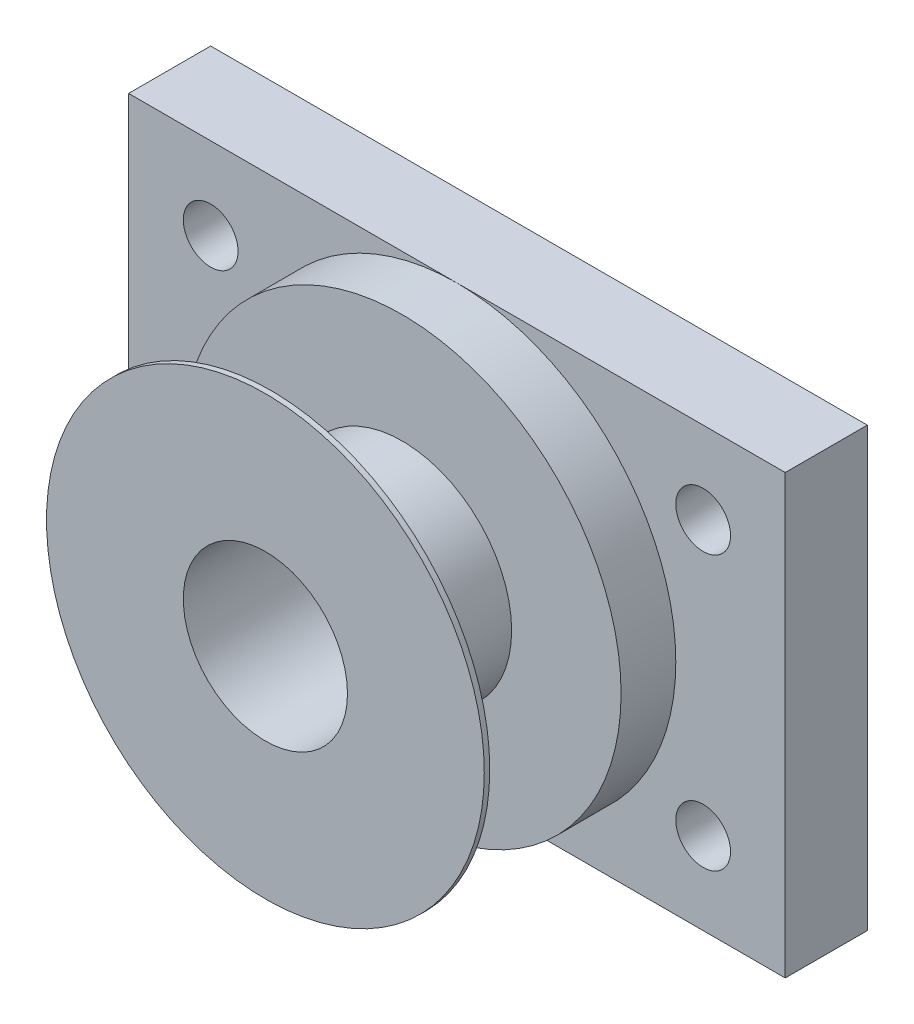
ISO-10303-21;
HEADER;
FILE_DESCRIPTION(('STEP AP214'),'2;1');
FILE_NAME('part.step','',(''),(''),'','','');
FILE_SCHEMA(('AUTOMOTIVE_DESIGN { 1 0 10303 214 1 1 1 1 }'));
ENDSEC;
DATA;
#1=APPLICATION_CONTEXT('core data for automotive mechanical design processes');
#2=APPLICATION_PROTOCOL_DEFINITION('international standard','automotive_design',2000,#1);
#3=PRODUCT_CONTEXT('',#1,'mechanical');
#4=PRODUCT('Part','Part','',(#3));
#5=PRODUCT_RELATED_PRODUCT_CATEGORY('part','',(#4));
#6=PRODUCT_DEFINITION_FORMATION('','',#4);
#7=PRODUCT_DEFINITION_CONTEXT('part definition',#1,'design');
#8=PRODUCT_DEFINITION('design','',#6,#7);
#9=PRODUCT_DEFINITION_SHAPE('','',#8);
#10=(LENGTH_UNIT() NAMED_UNIT(*) SI_UNIT(.MILLI.,.METRE.));
#11=(NAMED_UNIT(*) PLANE_ANGLE_UNIT() SI_UNIT($,.RADIAN.));
#12=(NAMED_UNIT(*) SI_UNIT($,.STERADIAN.) SOLID_ANGLE_UNIT());
#13=UNCERTAINTY_MEASURE_WITH_UNIT(LENGTH_MEASURE(1.E-05),#10,'distance_accuracy_value','');
#14=(GEOMETRIC_REPRESENTATION_CONTEXT(3) GLOBAL_UNCERTAINTY_ASSIGNED_CONTEXT((#13)) GLOBAL_UNIT_ASSIGNED_CONTEXT((#10,
#11,#12)) REPRESENTATION_CONTEXT('',''));
#15=CARTESIAN_POINT('',(0.,0.,0.));
#16=DIRECTION('',(0.,0.,1.));
#17=DIRECTION('',(1.,0.,0.));
#18=AXIS2_PLACEMENT_3D('',#15,#16,#17);
#19=CARTESIAN_POINT('',(0.,0.,15.));
#20=DIRECTION('',(0.,0.,1.));
#21=DIRECTION('',(1.,0.,0.));
#22=AXIS2_PLACEMENT_3D('',#19,#20,#21);
#23=PLANE('',#22);
#24=CARTESIAN_POINT('',(0.,0.,15.));
#25=DIRECTION('',(0.,0.,-1.));
#26=DIRECTION('',(1.,0.,0.));
#27=AXIS2_PLACEMENT_3D('',#24,#25,#26);
#28=CIRCLE('',#27,15.);
#29=CARTESIAN_POINT('',(15.,0.,15.));
#30=VERTEX_POINT('',#29);
#31=EDGE_CURVE('E24',#30,#30,#28,.T.);
#32=ORIENTED_EDGE('',*,*,#31,.F.);
#33=EDGE_LOOP('',(#32));
#34=FACE_BOUND('',#33,.T.);
#35=ADVANCED_FACE('F15',(#34),#23,.T.);
#36=CARTESIAN_POINT('',(0.,0.,0.));
#37=DIRECTION('',(0.,0.,-1.));
#38=DIRECTION('',(1.,0.,0.));
#39=AXIS2_PLACEMENT_3D('',#36,#37,#38);
#40=CYLINDRICAL_SURFACE('',#39,15.);
#41=ORIENTED_EDGE('',*,*,#31,.T.);
#42=DIRECTION('',(0.,0.,1.));
#43=VECTOR('',#42,1.);
#44=CARTESIAN_POINT('',(15.,0.,0.));
#45=LINE('',#44,#43);
#46=CARTESIAN_POINT('',(15.,0.,50.));
#47=VERTEX_POINT('',#46);
#48=EDGE_CURVE('E9',#30,#47,#45,.T.);
#49=ORIENTED_EDGE('',*,*,#48,.T.);
#50=CARTESIAN_POINT('',(0.,0.,50.));
#51=DIRECTION('',(0.,0.,-1.));
#52=DIRECTION('',(1.,0.,0.));
#53=AXIS2_PLACEMENT_3D('',#50,#51,#52);
#54=CIRCLE('',#53,15.);
#55=EDGE_CURVE('E91',#47,#47,#54,.T.);
#56=ORIENTED_EDGE('',*,*,#55,.F.);
#57=ORIENTED_EDGE('',*,*,#48,.F.);
#58=EDGE_LOOP('',(#41,#49,#56,#57));
#59=FACE_BOUND('',#58,.T.);
#60=ADVANCED_FACE('F156',(#59),#40,.F.);
#61=CARTESIAN_POINT('',(0.,0.,50.));
#62=DIRECTION('',(0.,0.,1.));
#63=DIRECTION('',(1.,0.,0.));
#64=AXIS2_PLACEMENT_3D('',#61,#62,#63);
#65=PLANE('',#64);
#66=ORIENTED_EDGE('',*,*,#55,.T.);
#67=EDGE_LOOP('',(#66));
#68=FACE_BOUND('',#67,.T.);
#69=CARTESIAN_POINT('',(0.,0.,50.));
#70=DIRECTION('',(0.,0.,1.));
#71=DIRECTION('',(1.,0.,0.));
#72=AXIS2_PLACEMENT_3D('',#69,#70,#71);
#73=CIRCLE('',#72,40.);
#74=CARTESIAN_POINT('',(40.,0.,50.));
#75=VERTEX_POINT('',#74);
#76=EDGE_CURVE('E88',#75,#75,#73,.T.);
#77=ORIENTED_EDGE('',*,*,#76,.T.);
#78=EDGE_LOOP('',(#77));
#79=FACE_BOUND('',#78,.T.);
#80=ADVANCED_FACE('F89',(#68,#79),#65,.T.);
#81=CARTESIAN_POINT('',(0.,0.,49.));
#82=DIRECTION('',(0.,0.,1.));
#83=DIRECTION('',(1.,0.,0.));
#84=AXIS2_PLACEMENT_3D('',#81,#82,#83);
#85=CYLINDRICAL_SURFACE('',#84,40.);
#86=CARTESIAN_POINT('',(0.,0.,49.));
#87=DIRECTION('',(0.,0.,1.));
#88=DIRECTION('',(1.,0.,0.));
#89=AXIS2_PLACEMENT_3D('',#86,#87,#88);
#90=CIRCLE('',#89,40.);
#91=CARTESIAN_POINT('',(40.,0.,49.));
#92=VERTEX_POINT('',#91);
#93=EDGE_CURVE('E100',#92,#92,#90,.T.);
#94=ORIENTED_EDGE('',*,*,#93,.T.);
#95=DIRECTION('',(0.,0.,1.));
#96=VECTOR('',#95,1.);
#97=CARTESIAN_POINT('',(40.,0.,49.));
#98=LINE('',#97,#96);
#99=EDGE_CURVE('E83',#92,#75,#98,.T.);
#100=ORIENTED_EDGE('',*,*,#99,.T.);
#101=ORIENTED_EDGE('',*,*,#76,.F.);
#102=ORIENTED_EDGE('',*,*,#99,.F.);
#103=EDGE_LOOP('',(#94,#100,#101,#102));
#104=FACE_BOUND('',#103,.T.);
#105=ADVANCED_FACE('F167',(#104),#85,.T.);
#106=CARTESIAN_POINT('',(0.,0.,49.));
#107=DIRECTION('',(0.,0.,1.));
#108=DIRECTION('',(1.,0.,0.));
#109=AXIS2_PLACEMENT_3D('',#106,#107,#108);
#110=PLANE('',#109);
#111=ORIENTED_EDGE('',*,*,#93,.F.);
#112=EDGE_LOOP('',(#111));
#113=FACE_BOUND('',#112,.T.);
#114=CARTESIAN_POINT('',(0.,0.,49.));
#115=DIRECTION('',(0.,0.,1.));
#116=DIRECTION('',(1.,0.,0.));
#117=AXIS2_PLACEMENT_3D('',#114,#115,#116);
#118=CIRCLE('',#117,20.);
#119=CARTESIAN_POINT('',(20.,0.,49.));
#120=VERTEX_POINT('',#119);
#121=EDGE_CURVE('E133',#120,#120,#118,.T.);
#122=ORIENTED_EDGE('',*,*,#121,.T.);
#123=EDGE_LOOP('',(#122));
#124=FACE_BOUND('',#123,.T.);
#125=ADVANCED_FACE('F212',(#113,#124),#110,.F.);
#126=CARTESIAN_POINT('',(0.,0.,25.));
#127=DIRECTION('',(0.,0.,1.));
#128=DIRECTION('',(1.,0.,0.));
#129=AXIS2_PLACEMENT_3D('',#126,#127,#128);
#130=CYLINDRICAL_SURFACE('',#129,20.);
#131=CARTESIAN_POINT('',(0.,0.,25.));
#132=DIRECTION('',(0.,0.,1.));
#133=DIRECTION('',(1.,0.,0.));
#134=AXIS2_PLACEMENT_3D('',#131,#132,#133);
#135=CIRCLE('',#134,20.);
#136=CARTESIAN_POINT('',(20.,0.,25.));
#137=VERTEX_POINT('',#136);
#138=EDGE_CURVE('E134',#137,#137,#135,.T.);
#139=ORIENTED_EDGE('',*,*,#138,.T.);
#140=DIRECTION('',(0.,0.,1.));
#141=VECTOR('',#140,1.);
#142=CARTESIAN_POINT('',(20.,0.,25.));
#143=LINE('',#142,#141);
#144=EDGE_CURVE('E129',#137,#120,#143,.T.);
#145=ORIENTED_EDGE('',*,*,#144,.T.);
#146=ORIENTED_EDGE('',*,*,#121,.F.);
#147=ORIENTED_EDGE('',*,*,#144,.F.);
#148=EDGE_LOOP('',(#139,#145,#146,#147));
#149=FACE_BOUND('',#148,.T.);
#150=ADVANCED_FACE('F205',(#149),#130,.T.);
#151=CARTESIAN_POINT('',(0.,0.,25.));
#152=DIRECTION('',(0.,0.,1.));
#153=DIRECTION('',(1.,0.,0.));
#154=AXIS2_PLACEMENT_3D('',#151,#152,#153);
#155=PLANE('',#154);
#156=ORIENTED_EDGE('',*,*,#138,.F.);
#157=EDGE_LOOP('',(#156));
#158=FACE_BOUND('',#157,.T.);
#159=CARTESIAN_POINT('',(0.,0.,25.));
#160=DIRECTION('',(0.,0.,1.));
#161=DIRECTION('',(1.,0.,0.));
#162=AXIS2_PLACEMENT_3D('',#159,#160,#161);
#163=CIRCLE('',#162,40.);
#164=CARTESIAN_POINT('',(40.,0.,25.));
#165=VERTEX_POINT('',#164);
#166=EDGE_CURVE('E149',#165,#165,#163,.T.);
#167=ORIENTED_EDGE('',*,*,#166,.T.);
#168=EDGE_LOOP('',(#167));
#169=FACE_BOUND('',#168,.T.);
#170=ADVANCED_FACE('F202',(#158,#169),#155,.T.);
#171=CARTESIAN_POINT('',(0.,0.,0.));
#172=DIRECTION('',(0.,0.,1.));
#173=DIRECTION('',(1.,0.,0.));
#174=AXIS2_PLACEMENT_3D('',#171,#172,#173);
#175=CYLINDRICAL_SURFACE('',#174,40.);
#176=CARTESIAN_POINT('',(0.,0.,15.));
#177=DIRECTION('',(0.,0.,1.));
#178=DIRECTION('',(1.,0.,0.));
#179=AXIS2_PLACEMENT_3D('',#176,#177,#178);
#180=CIRCLE('',#179,40.);
#181=CARTESIAN_POINT('',(0.,-40.,15.));
#182=VERTEX_POINT('',#181);
#183=CARTESIAN_POINT('',(40.,0.,15.));
#184=VERTEX_POINT('',#183);
#185=EDGE_CURVE('E128',#182,#184,#180,.T.);
#186=ORIENTED_EDGE('',*,*,#185,.T.);
#187=DIRECTION('',(0.,0.,1.));
#188=VECTOR('',#187,1.);
#189=CARTESIAN_POINT('',(40.,0.,0.));
#190=LINE('',#189,#188);
#191=EDGE_CURVE('E145',#184,#165,#190,.T.);
#192=ORIENTED_EDGE('',*,*,#191,.T.);
#193=ORIENTED_EDGE('',*,*,#166,.F.);
#194=ORIENTED_EDGE('',*,*,#191,.F.);
#195=CARTESIAN_POINT('',(0.,0.,15.));
#196=DIRECTION('',(0.,0.,1.));
#197=DIRECTION('',(1.,0.,0.));
#198=AXIS2_PLACEMENT_3D('',#195,#196,#197);
#199=CIRCLE('',#198,40.);
#200=CARTESIAN_POINT('',(0.,40.,15.));
#201=VERTEX_POINT('',#200);
#202=EDGE_CURVE('E138',#184,#201,#199,.T.);
#203=ORIENTED_EDGE('',*,*,#202,.T.);
#204=CARTESIAN_POINT('',(0.,0.,15.));
#205=DIRECTION('',(0.,0.,1.));
#206=DIRECTION('',(1.,0.,0.));
#207=AXIS2_PLACEMENT_3D('',#204,#205,#206);
#208=CIRCLE('',#207,40.);
#209=EDGE_CURVE('E142',#201,#182,#208,.T.);
#210=ORIENTED_EDGE('',*,*,#209,.T.);
#211=EDGE_LOOP('',(#186,#192,#193,#194,#203,#210));
#212=FACE_BOUND('',#211,.T.);
#213=ADVANCED_FACE('F191',(#212),#175,.T.);
#214=CARTESIAN_POINT('',(0.,0.,15.));
#215=DIRECTION('',(0.,0.,1.));
#216=DIRECTION('',(1.,0.,0.));
#217=AXIS2_PLACEMENT_3D('',#214,#215,#216);
#218=PLANE('',#217);
#219=CARTESIAN_POINT('',(-45.,25.,15.));
#220=DIRECTION('',(0.,0.,-1.));
#221=DIRECTION('',(1.,0.,0.));
#222=AXIS2_PLACEMENT_3D('',#219,#220,#221);
#223=CIRCLE('',#222,5.);
#224=CARTESIAN_POINT('',(-40.,25.,15.));
#225=VERTEX_POINT('',#224);
#226=EDGE_CURVE('E125',#225,#225,#223,.T.);
#227=ORIENTED_EDGE('',*,*,#226,.T.);
#228=EDGE_LOOP('',(#227));
#229=FACE_BOUND('',#228,.T.);
#230=CARTESIAN_POINT('',(-45.,-25.,15.));
#231=DIRECTION('',(0.,0.,-1.));
#232=DIRECTION('',(1.,0.,0.));
#233=AXIS2_PLACEMENT_3D('',#230,#231,#232);
#234=CIRCLE('',#233,5.);
#235=CARTESIAN_POINT('',(-40.,-25.,15.));
#236=VERTEX_POINT('',#235);
#237=EDGE_CURVE('E117',#236,#236,#234,.T.);
#238=ORIENTED_EDGE('',*,*,#237,.T.);
#239=EDGE_LOOP('',(#238));
#240=FACE_BOUND('',#239,.T.);
#241=DIRECTION('',(0.,-1.,0.));
#242=VECTOR('',#241,1.);
#243=CARTESIAN_POINT('',(-60.,40.,15.));
#244=LINE('',#243,#242);
#245=CARTESIAN_POINT('',(-60.,40.,15.));
#246=VERTEX_POINT('',#245);
#247=CARTESIAN_POINT('',(-60.,-40.,15.));
#248=VERTEX_POINT('',#247);
#249=EDGE_CURVE('E109',#246,#248,#244,.T.);
#250=ORIENTED_EDGE('',*,*,#249,.T.);
#251=DIRECTION('',(1.,0.,0.));
#252=VECTOR('',#251,1.);
#253=CARTESIAN_POINT('',(-60.,-40.,15.));
#254=LINE('',#253,#252);
#255=EDGE_CURVE('E283',#248,#182,#254,.T.);
#256=ORIENTED_EDGE('',*,*,#255,.T.);
#257=ORIENTED_EDGE('',*,*,#209,.F.);
#258=DIRECTION('',(-1.,0.,0.));
#259=VECTOR('',#258,1.);
#260=CARTESIAN_POINT('',(60.,40.,15.));
#261=LINE('',#260,#259);
#262=EDGE_CURVE('E246',#201,#246,#261,.T.);
#263=ORIENTED_EDGE('',*,*,#262,.T.);
#264=EDGE_LOOP('',(#250,#256,#257,#263));
#265=FACE_BOUND('',#264,.T.);
#266=ADVANCED_FACE('F188',(#229,#240,#265),#218,.T.);
#267=CARTESIAN_POINT('',(0.,0.,15.));
#268=DIRECTION('',(0.,0.,1.));
#269=DIRECTION('',(1.,0.,0.));
#270=AXIS2_PLACEMENT_3D('',#267,#268,#269);
#271=PLANE('',#270);
#272=CARTESIAN_POINT('',(45.,25.,15.));
#273=DIRECTION('',(0.,0.,-1.));
#274=DIRECTION('',(1.,0.,0.));
#275=AXIS2_PLACEMENT_3D('',#272,#273,#274);
#276=CIRCLE('',#275,5.);
#277=CARTESIAN_POINT('',(50.,25.,15.));
#278=VERTEX_POINT('',#277);
#279=EDGE_CURVE('E106',#278,#278,#276,.T.);
#280=ORIENTED_EDGE('',*,*,#279,.T.);
#281=EDGE_LOOP('',(#280));
#282=FACE_BOUND('',#281,.T.);
#283=CARTESIAN_POINT('',(45.,-25.,15.));
#284=DIRECTION('',(0.,0.,-1.));
#285=DIRECTION('',(1.,0.,0.));
#286=AXIS2_PLACEMENT_3D('',#283,#284,#285);
#287=CIRCLE('',#286,5.);
#288=CARTESIAN_POINT('',(50.,-25.,15.));
#289=VERTEX_POINT('',#288);
#290=EDGE_CURVE('E272',#289,#289,#287,.T.);
#291=ORIENTED_EDGE('',*,*,#290,.T.);
#292=EDGE_LOOP('',(#291));
#293=FACE_BOUND('',#292,.T.);
#294=ORIENTED_EDGE('',*,*,#185,.F.);
#295=DIRECTION('',(1.,0.,0.));
#296=VECTOR('',#295,1.);
#297=CARTESIAN_POINT('',(-60.,-40.,15.));
#298=LINE('',#297,#296);
#299=CARTESIAN_POINT('',(60.,-40.,15.));
#300=VERTEX_POINT('',#299);
#301=EDGE_CURVE('E288',#182,#300,#298,.T.);
#302=ORIENTED_EDGE('',*,*,#301,.T.);
#303=DIRECTION('',(0.,1.,0.));
#304=VECTOR('',#303,1.);
#305=CARTESIAN_POINT('',(60.,-40.,15.));
#306=LINE('',#305,#304);
#307=CARTESIAN_POINT('',(60.,40.,15.));
#308=VERTEX_POINT('',#307);
#309=EDGE_CURVE('E289',#300,#308,#306,.T.);
#310=ORIENTED_EDGE('',*,*,#309,.T.);
#311=DIRECTION('',(-1.,0.,0.));
#312=VECTOR('',#311,1.);
#313=CARTESIAN_POINT('',(60.,40.,15.));
#314=LINE('',#313,#312);
#315=EDGE_CURVE('E242',#308,#201,#314,.T.);
#316=ORIENTED_EDGE('',*,*,#315,.T.);
#317=ORIENTED_EDGE('',*,*,#202,.F.);
#318=EDGE_LOOP('',(#294,#302,#310,#316,#317));
#319=FACE_BOUND('',#318,.T.);
#320=ADVANCED_FACE('F182',(#282,#293,#319),#271,.T.);
#321=CARTESIAN_POINT('',(-45.,25.,0.));
#322=DIRECTION('',(0.,0.,-1.));
#323=DIRECTION('',(1.,0.,0.));
#324=AXIS2_PLACEMENT_3D('',#321,#322,#323);
#325=CYLINDRICAL_SURFACE('',#324,5.);
#326=CARTESIAN_POINT('',(-45.,25.,0.));
#327=DIRECTION('',(0.,0.,1.));
#328=DIRECTION('',(1.,0.,0.));
#329=AXIS2_PLACEMENT_3D('',#326,#327,#328);
#330=CIRCLE('',#329,5.);
#331=CARTESIAN_POINT('',(-40.,25.,0.));
#332=VERTEX_POINT('',#331);
#333=EDGE_CURVE('E252',#332,#332,#330,.T.);
#334=ORIENTED_EDGE('',*,*,#333,.F.);
#335=DIRECTION('',(0.,0.,1.));
#336=VECTOR('',#335,1.);
#337=CARTESIAN_POINT('',(-40.,25.,0.));
#338=LINE('',#337,#336);
#339=EDGE_CURVE('E121',#332,#225,#338,.T.);
#340=ORIENTED_EDGE('',*,*,#339,.T.);
#341=ORIENTED_EDGE('',*,*,#226,.F.);
#342=ORIENTED_EDGE('',*,*,#339,.F.);
#343=EDGE_LOOP('',(#334,#340,#341,#342));
#344=FACE_BOUND('',#343,.T.);
#345=ADVANCED_FACE('F178',(#344),#325,.F.);
#346=CARTESIAN_POINT('',(-45.,-25.,0.));
#347=DIRECTION('',(0.,0.,-1.));
#348=DIRECTION('',(1.,0.,0.));
#349=AXIS2_PLACEMENT_3D('',#346,#347,#348);
#350=CYLINDRICAL_SURFACE('',#349,5.);
#351=CARTESIAN_POINT('',(-45.,-25.,0.));
#352=DIRECTION('',(0.,0.,1.));
#353=DIRECTION('',(1.,0.,0.));
#354=AXIS2_PLACEMENT_3D('',#351,#352,#353);
#355=CIRCLE('',#354,5.);
#356=CARTESIAN_POINT('',(-40.,-25.,0.));
#357=VERTEX_POINT('',#356);
#358=EDGE_CURVE('E248',#357,#357,#355,.T.);
#359=ORIENTED_EDGE('',*,*,#358,.F.);
#360=DIRECTION('',(0.,0.,1.));
#361=VECTOR('',#360,1.);
#362=CARTESIAN_POINT('',(-40.,-25.,0.));
#363=LINE('',#362,#361);
#364=EDGE_CURVE('E113',#357,#236,#363,.T.);
#365=ORIENTED_EDGE('',*,*,#364,.T.);
#366=ORIENTED_EDGE('',*,*,#237,.F.);
#367=ORIENTED_EDGE('',*,*,#364,.F.);
#368=EDGE_LOOP('',(#359,#365,#366,#367));
#369=FACE_BOUND('',#368,.T.);
#370=ADVANCED_FACE('F181',(#369),#350,.F.);
#371=CARTESIAN_POINT('',(-60.,40.,0.));
#372=DIRECTION('',(1.,0.,0.));
#373=DIRECTION('',(0.,1.,0.));
#374=AXIS2_PLACEMENT_3D('',#371,#372,#373);
#375=PLANE('',#374);
#376=DIRECTION('',(0.,-1.,0.));
#377=VECTOR('',#376,1.);
#378=CARTESIAN_POINT('',(-60.,40.,0.));
#379=LINE('',#378,#377);
#380=CARTESIAN_POINT('',(-60.,40.,0.));
#381=VERTEX_POINT('',#380);
#382=CARTESIAN_POINT('',(-60.,-40.,0.));
#383=VERTEX_POINT('',#382);
#384=EDGE_CURVE('E261',#381,#383,#379,.T.);
#385=ORIENTED_EDGE('',*,*,#384,.T.);
#386=DIRECTION('',(0.,0.,1.));
#387=VECTOR('',#386,1.);
#388=CARTESIAN_POINT('',(-60.,-40.,0.));
#389=LINE('',#388,#387);
#390=EDGE_CURVE('E287',#383,#248,#389,.T.);
#391=ORIENTED_EDGE('',*,*,#390,.T.);
#392=ORIENTED_EDGE('',*,*,#249,.F.);
#393=DIRECTION('',(0.,0.,1.));
#394=VECTOR('',#393,1.);
#395=CARTESIAN_POINT('',(-60.,40.,0.));
#396=LINE('',#395,#394);
#397=EDGE_CURVE('E251',#381,#246,#396,.T.);
#398=ORIENTED_EDGE('',*,*,#397,.F.);
#399=EDGE_LOOP('',(#385,#391,#392,#398));
#400=FACE_BOUND('',#399,.T.);
#401=ADVANCED_FACE('F186',(#400),#375,.F.);
#402=CARTESIAN_POINT('',(45.,25.,0.));
#403=DIRECTION('',(0.,0.,-1.));
#404=DIRECTION('',(1.,0.,0.));
#405=AXIS2_PLACEMENT_3D('',#402,#403,#404);
#406=CYLINDRICAL_SURFACE('',#405,5.);
#407=CARTESIAN_POINT('',(45.,25.,0.));
#408=DIRECTION('',(0.,0.,1.));
#409=DIRECTION('',(1.,0.,0.));
#410=AXIS2_PLACEMENT_3D('',#407,#408,#409);
#411=CIRCLE('',#410,5.);
#412=CARTESIAN_POINT('',(50.,25.,0.));
#413=VERTEX_POINT('',#412);
#414=EDGE_CURVE('E241',#413,#413,#411,.T.);
#415=ORIENTED_EDGE('',*,*,#414,.F.);
#416=DIRECTION('',(0.,0.,1.));
#417=VECTOR('',#416,1.);
#418=CARTESIAN_POINT('',(50.,25.,0.));
#419=LINE('',#418,#417);
#420=EDGE_CURVE('E104',#413,#278,#419,.T.);
#421=ORIENTED_EDGE('',*,*,#420,.T.);
#422=ORIENTED_EDGE('',*,*,#279,.F.);
#423=ORIENTED_EDGE('',*,*,#420,.F.);
#424=EDGE_LOOP('',(#415,#421,#422,#423));
#425=FACE_BOUND('',#424,.T.);
#426=ADVANCED_FACE('F176',(#425),#406,.F.);
#427=CARTESIAN_POINT('',(45.,-25.,0.));
#428=DIRECTION('',(0.,0.,-1.));
#429=DIRECTION('',(1.,0.,0.));
#430=AXIS2_PLACEMENT_3D('',#427,#428,#429);
#431=CYLINDRICAL_SURFACE('',#430,5.);
#432=CARTESIAN_POINT('',(45.,-25.,0.));
#433=DIRECTION('',(0.,0.,1.));
#434=DIRECTION('',(1.,0.,0.));
#435=AXIS2_PLACEMENT_3D('',#432,#433,#434);
#436=CIRCLE('',#435,5.);
#437=CARTESIAN_POINT('',(50.,-25.,0.));
#438=VERTEX_POINT('',#437);
#439=EDGE_CURVE('E238',#438,#438,#436,.T.);
#440=ORIENTED_EDGE('',*,*,#439,.F.);
#441=DIRECTION('',(0.,0.,1.));
#442=VECTOR('',#441,1.);
#443=CARTESIAN_POINT('',(50.,-25.,0.));
#444=LINE('',#443,#442);
#445=EDGE_CURVE('E276',#438,#289,#444,.T.);
#446=ORIENTED_EDGE('',*,*,#445,.T.);
#447=ORIENTED_EDGE('',*,*,#290,.F.);
#448=ORIENTED_EDGE('',*,*,#445,.F.);
#449=EDGE_LOOP('',(#440,#446,#447,#448));
#450=FACE_BOUND('',#449,.T.);
#451=ADVANCED_FACE('F173',(#450),#431,.F.);
#452=CARTESIAN_POINT('',(-60.,-40.,0.));
#453=DIRECTION('',(0.,1.,0.));
#454=DIRECTION('',(1.,0.,0.));
#455=AXIS2_PLACEMENT_3D('',#452,#453,#454);
#456=PLANE('',#455);
#457=DIRECTION('',(0.,0.,1.));
#458=VECTOR('',#457,1.);
#459=CARTESIAN_POINT('',(60.,-40.,0.));
#460=LINE('',#459,#458);
#461=CARTESIAN_POINT('',(60.,-40.,0.));
#462=VERTEX_POINT('',#461);
#463=EDGE_CURVE('E292',#462,#300,#460,.T.);
#464=ORIENTED_EDGE('',*,*,#463,.T.);
#465=ORIENTED_EDGE('',*,*,#301,.F.);
#466=ORIENTED_EDGE('',*,*,#255,.F.);
#467=ORIENTED_EDGE('',*,*,#390,.F.);
#468=DIRECTION('',(-1.,0.,0.));
#469=VECTOR('',#468,1.);
#470=CARTESIAN_POINT('',(60.,-40.,0.));
#471=LINE('',#470,#469);
#472=EDGE_CURVE('E237',#462,#383,#471,.T.);
#473=ORIENTED_EDGE('',*,*,#472,.F.);
#474=EDGE_LOOP('',(#464,#465,#466,#467,#473));
#475=FACE_BOUND('',#474,.T.);
#476=ADVANCED_FACE('F171',(#475),#456,.F.);
#477=CARTESIAN_POINT('',(60.,-40.,0.));
#478=DIRECTION('',(-1.,0.,0.));
#479=DIRECTION('',(0.,0.,1.));
#480=AXIS2_PLACEMENT_3D('',#477,#478,#479);
#481=PLANE('',#480);
#482=DIRECTION('',(0.,1.,0.));
#483=VECTOR('',#482,1.);
#484=CARTESIAN_POINT('',(60.,-40.,0.));
#485=LINE('',#484,#483);
#486=CARTESIAN_POINT('',(60.,40.,0.));
#487=VERTEX_POINT('',#486);
#488=EDGE_CURVE('E257',#462,#487,#485,.T.);
#489=ORIENTED_EDGE('',*,*,#488,.T.);
#490=DIRECTION('',(0.,0.,1.));
#491=VECTOR('',#490,1.);
#492=CARTESIAN_POINT('',(60.,40.,0.));
#493=LINE('',#492,#491);
#494=EDGE_CURVE('E245',#487,#308,#493,.T.);
#495=ORIENTED_EDGE('',*,*,#494,.T.);
#496=ORIENTED_EDGE('',*,*,#309,.F.);
#497=ORIENTED_EDGE('',*,*,#463,.F.);
#498=EDGE_LOOP('',(#489,#495,#496,#497));
#499=FACE_BOUND('',#498,.T.);
#500=ADVANCED_FACE('F326',(#499),#481,.F.);
#501=CARTESIAN_POINT('',(60.,40.,0.));
#502=DIRECTION('',(0.,-1.,0.));
#503=DIRECTION('',(0.,0.,-1.));
#504=AXIS2_PLACEMENT_3D('',#501,#502,#503);
#505=PLANE('',#504);
#506=DIRECTION('',(1.,0.,0.));
#507=VECTOR('',#506,1.);
#508=CARTESIAN_POINT('',(-60.,40.,0.));
#509=LINE('',#508,#507);
#510=EDGE_CURVE('E265',#381,#487,#509,.T.);
#511=ORIENTED_EDGE('',*,*,#510,.F.);
#512=ORIENTED_EDGE('',*,*,#397,.T.);
#513=ORIENTED_EDGE('',*,*,#262,.F.);
#514=ORIENTED_EDGE('',*,*,#315,.F.);
#515=ORIENTED_EDGE('',*,*,#494,.F.);
#516=EDGE_LOOP('',(#511,#512,#513,#514,#515));
#517=FACE_BOUND('',#516,.T.);
#518=ADVANCED_FACE('F320',(#517),#505,.F.);
#519=CARTESIAN_POINT('',(0.,0.,0.));
#520=DIRECTION('',(0.,0.,1.));
#521=DIRECTION('',(1.,0.,0.));
#522=AXIS2_PLACEMENT_3D('',#519,#520,#521);
#523=PLANE('',#522);
#524=ORIENTED_EDGE('',*,*,#358,.T.);
#525=EDGE_LOOP('',(#524));
#526=FACE_BOUND('',#525,.T.);
#527=ORIENTED_EDGE('',*,*,#333,.T.);
#528=EDGE_LOOP('',(#527));
#529=FACE_BOUND('',#528,.T.);
#530=ORIENTED_EDGE('',*,*,#488,.F.);
#531=ORIENTED_EDGE('',*,*,#472,.T.);
#532=ORIENTED_EDGE('',*,*,#384,.F.);
#533=ORIENTED_EDGE('',*,*,#510,.T.);
#534=EDGE_LOOP('',(#530,#531,#532,#533));
#535=FACE_BOUND('',#534,.T.);
#536=ORIENTED_EDGE('',*,*,#414,.T.);
#537=EDGE_LOOP('',(#536));
#538=FACE_BOUND('',#537,.T.);
#539=ORIENTED_EDGE('',*,*,#439,.T.);
#540=EDGE_LOOP('',(#539));
#541=FACE_BOUND('',#540,.T.);
#542=ADVANCED_FACE('F318',(#526,#529,#535,#538,#541),#523,.F.);
#543=CLOSED_SHELL('',(#35,#60,#80,#105,#125,#150,#170,#213,#266,#320,#345,#370,#401,#426,#451,
#476,#500,#518,#542));
#544=MANIFOLD_SOLID_BREP('B1',#543);
#545=ADVANCED_BREP_SHAPE_REPRESENTATION('',(#18,#544),#14);
#546=SHAPE_DEFINITION_REPRESENTATION(#9,#545);
ENDSEC;
END-ISO-10303-21;
